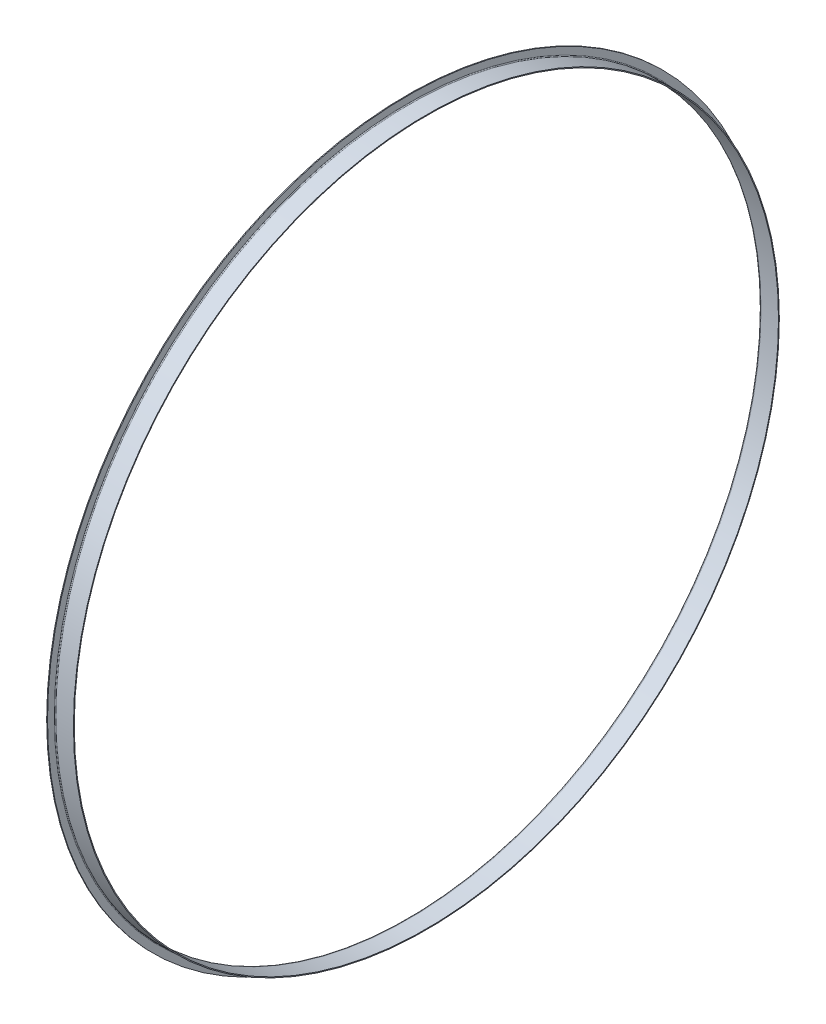
ISO-10303-21;
HEADER;
FILE_DESCRIPTION(('STEP AP214'),'2;1');
FILE_NAME('part.step','',(''),(''),'','','');
FILE_SCHEMA(('AUTOMOTIVE_DESIGN { 1 0 10303 214 1 1 1 1 }'));
ENDSEC;
DATA;
#1=APPLICATION_CONTEXT('core data for automotive mechanical design processes');
#2=APPLICATION_PROTOCOL_DEFINITION('international standard','automotive_design',2000,#1);
#3=PRODUCT_CONTEXT('',#1,'mechanical');
#4=PRODUCT('Part','Part','',(#3));
#5=PRODUCT_RELATED_PRODUCT_CATEGORY('part','',(#4));
#6=PRODUCT_DEFINITION_FORMATION('','',#4);
#7=PRODUCT_DEFINITION_CONTEXT('part definition',#1,'design');
#8=PRODUCT_DEFINITION('design','',#6,#7);
#9=PRODUCT_DEFINITION_SHAPE('','',#8);
#10=(LENGTH_UNIT() NAMED_UNIT(*) SI_UNIT(.MILLI.,.METRE.));
#11=(NAMED_UNIT(*) PLANE_ANGLE_UNIT() SI_UNIT($,.RADIAN.));
#12=(NAMED_UNIT(*) SI_UNIT($,.STERADIAN.) SOLID_ANGLE_UNIT());
#13=UNCERTAINTY_MEASURE_WITH_UNIT(LENGTH_MEASURE(1.E-05),#10,'distance_accuracy_value','');
#14=(GEOMETRIC_REPRESENTATION_CONTEXT(3) GLOBAL_UNCERTAINTY_ASSIGNED_CONTEXT((#13)) GLOBAL_UNIT_ASSIGNED_CONTEXT((#10,
#11,#12)) REPRESENTATION_CONTEXT('',''));
#15=CARTESIAN_POINT('',(0.,0.,0.));
#16=DIRECTION('',(0.,0.,1.));
#17=DIRECTION('',(1.,0.,0.));
#18=AXIS2_PLACEMENT_3D('',#15,#16,#17);
#19=CARTESIAN_POINT('',(12.439024390244,118.402071405808,0.));
#20=DIRECTION('',(-1.,0.,0.));
#21=DIRECTION('',(0.,0.,1.));
#22=AXIS2_PLACEMENT_3D('',#19,#20,#21);
#23=PLANE('',#22);
#24=CARTESIAN_POINT('',(12.439024390244,-1134.59792859419,0.));
#25=DIRECTION('',(-1.,0.,0.));
#26=DIRECTION('',(0.,0.,1.));
#27=AXIS2_PLACEMENT_3D('',#24,#25,#26);
#28=CIRCLE('',#27,1253.);
#29=CARTESIAN_POINT('',(12.439024390244,-1134.59792859419,1253.));
#30=VERTEX_POINT('',#29);
#31=EDGE_CURVE('E58',#30,#30,#28,.T.);
#32=ORIENTED_EDGE('',*,*,#31,.F.);
#33=EDGE_LOOP('',(#32));
#34=FACE_BOUND('',#33,.T.);
#35=CARTESIAN_POINT('',(12.439024390244,-1134.59792859419,0.));
#36=DIRECTION('',(-1.,0.,0.));
#37=DIRECTION('',(0.,0.,1.));
#38=AXIS2_PLACEMENT_3D('',#35,#36,#37);
#39=CIRCLE('',#38,1250.);
#40=CARTESIAN_POINT('',(12.439024390244,-1134.59792859419,1250.));
#41=VERTEX_POINT('',#40);
#42=EDGE_CURVE('E10',#41,#41,#39,.T.);
#43=ORIENTED_EDGE('',*,*,#42,.T.);
#44=EDGE_LOOP('',(#43));
#45=FACE_BOUND('',#44,.T.);
#46=ADVANCED_FACE('F30',(#34,#45),#23,.F.);
#47=CARTESIAN_POINT('',(-55.5609756097559,-1134.59792859419,0.));
#48=DIRECTION('',(-1.,0.,0.));
#49=DIRECTION('',(0.,0.,1.));
#50=AXIS2_PLACEMENT_3D('',#47,#48,#49);
#51=CYLINDRICAL_SURFACE('',#50,1250.);
#52=ORIENTED_EDGE('',*,*,#42,.F.);
#53=EDGE_LOOP('',(#52));
#54=FACE_BOUND('',#53,.T.);
#55=CARTESIAN_POINT('',(-49.560975609756,-1134.59792859419,0.));
#56=DIRECTION('',(-1.,0.,0.));
#57=DIRECTION('',(0.,0.,1.));
#58=AXIS2_PLACEMENT_3D('',#55,#56,#57);
#59=CIRCLE('',#58,1250.);
#60=CARTESIAN_POINT('',(-49.560975609756,-1134.59792859419,1250.));
#61=VERTEX_POINT('',#60);
#62=EDGE_CURVE('E36',#61,#61,#59,.T.);
#63=ORIENTED_EDGE('',*,*,#62,.T.);
#64=EDGE_LOOP('',(#63));
#65=FACE_BOUND('',#64,.T.);
#66=ADVANCED_FACE('F65',(#54,#65),#51,.F.);
#67=CARTESIAN_POINT('',(-49.560975609756,-1134.59792859419,0.));
#68=DIRECTION('',(-1.,0.,0.));
#69=DIRECTION('',(0.,0.,1.));
#70=AXIS2_PLACEMENT_3D('',#67,#68,#69);
#71=TOROIDAL_SURFACE('',#70,1256.,6.);
#72=ORIENTED_EDGE('',*,*,#62,.F.);
#73=EDGE_LOOP('',(#72));
#74=FACE_BOUND('',#73,.T.);
#75=CARTESIAN_POINT('',(-55.560975609756,-1134.59792859419,0.));
#76=DIRECTION('',(-1.,0.,0.));
#77=DIRECTION('',(0.,0.,1.));
#78=AXIS2_PLACEMENT_3D('',#75,#76,#77);
#79=CIRCLE('',#78,1256.);
#80=CARTESIAN_POINT('',(-55.560975609756,-1134.59792859419,1256.));
#81=VERTEX_POINT('',#80);
#82=EDGE_CURVE('E40',#81,#81,#79,.T.);
#83=ORIENTED_EDGE('',*,*,#82,.T.);
#84=EDGE_LOOP('',(#83));
#85=FACE_BOUND('',#84,.T.);
#86=ADVANCED_FACE('F69',(#74,#85),#71,.T.);
#87=CARTESIAN_POINT('',(-55.560975609756,121.402071405808,0.));
#88=DIRECTION('',(1.,0.,0.));
#89=DIRECTION('',(0.,0.,-1.));
#90=AXIS2_PLACEMENT_3D('',#87,#88,#89);
#91=PLANE('',#90);
#92=ORIENTED_EDGE('',*,*,#82,.F.);
#93=EDGE_LOOP('',(#92));
#94=FACE_BOUND('',#93,.T.);
#95=CARTESIAN_POINT('',(-55.560975609756,-1134.59792859419,0.));
#96=DIRECTION('',(-1.,0.,0.));
#97=DIRECTION('',(0.,0.,1.));
#98=AXIS2_PLACEMENT_3D('',#95,#96,#97);
#99=CIRCLE('',#98,1280.);
#100=CARTESIAN_POINT('',(-55.560975609756,-1134.59792859419,1280.));
#101=VERTEX_POINT('',#100);
#102=EDGE_CURVE('E44',#101,#101,#99,.T.);
#103=ORIENTED_EDGE('',*,*,#102,.T.);
#104=EDGE_LOOP('',(#103));
#105=FACE_BOUND('',#104,.T.);
#106=ADVANCED_FACE('F74',(#94,#105),#91,.F.);
#107=CARTESIAN_POINT('',(-55.5609756097559,-1134.59792859419,0.));
#108=DIRECTION('',(-1.,0.,0.));
#109=DIRECTION('',(0.,0.,1.));
#110=AXIS2_PLACEMENT_3D('',#107,#108,#109);
#111=CYLINDRICAL_SURFACE('',#110,1280.);
#112=ORIENTED_EDGE('',*,*,#102,.F.);
#113=EDGE_LOOP('',(#112));
#114=FACE_BOUND('',#113,.T.);
#115=CARTESIAN_POINT('',(-52.560975609756,-1134.59792859419,0.));
#116=DIRECTION('',(-1.,0.,0.));
#117=DIRECTION('',(0.,0.,1.));
#118=AXIS2_PLACEMENT_3D('',#115,#116,#117);
#119=CIRCLE('',#118,1280.);
#120=CARTESIAN_POINT('',(-52.560975609756,-1134.59792859419,1280.));
#121=VERTEX_POINT('',#120);
#122=EDGE_CURVE('E49',#121,#121,#119,.T.);
#123=ORIENTED_EDGE('',*,*,#122,.T.);
#124=EDGE_LOOP('',(#123));
#125=FACE_BOUND('',#124,.T.);
#126=ADVANCED_FACE('F80',(#114,#125),#111,.T.);
#127=CARTESIAN_POINT('',(-52.560975609756,145.402071405808,0.));
#128=DIRECTION('',(-1.,0.,0.));
#129=DIRECTION('',(0.,0.,1.));
#130=AXIS2_PLACEMENT_3D('',#127,#128,#129);
#131=PLANE('',#130);
#132=ORIENTED_EDGE('',*,*,#122,.F.);
#133=EDGE_LOOP('',(#132));
#134=FACE_BOUND('',#133,.T.);
#135=CARTESIAN_POINT('',(-52.560975609756,-1134.59792859419,0.));
#136=DIRECTION('',(-1.,0.,0.));
#137=DIRECTION('',(0.,0.,1.));
#138=AXIS2_PLACEMENT_3D('',#135,#136,#137);
#139=CIRCLE('',#138,1256.);
#140=CARTESIAN_POINT('',(-52.560975609756,-1134.59792859419,1256.));
#141=VERTEX_POINT('',#140);
#142=EDGE_CURVE('E52',#141,#141,#139,.T.);
#143=ORIENTED_EDGE('',*,*,#142,.T.);
#144=EDGE_LOOP('',(#143));
#145=FACE_BOUND('',#144,.T.);
#146=ADVANCED_FACE('F84',(#134,#145),#131,.F.);
#147=CARTESIAN_POINT('',(-49.560975609756,-1134.59792859419,0.));
#148=DIRECTION('',(-1.,0.,0.));
#149=DIRECTION('',(0.,0.,1.));
#150=AXIS2_PLACEMENT_3D('',#147,#148,#149);
#151=TOROIDAL_SURFACE('',#150,1256.,3.);
#152=ORIENTED_EDGE('',*,*,#142,.F.);
#153=EDGE_LOOP('',(#152));
#154=FACE_BOUND('',#153,.T.);
#155=CARTESIAN_POINT('',(-49.560975609756,-1134.59792859419,0.));
#156=DIRECTION('',(-1.,0.,0.));
#157=DIRECTION('',(0.,0.,1.));
#158=AXIS2_PLACEMENT_3D('',#155,#156,#157);
#159=CIRCLE('',#158,1253.);
#160=CARTESIAN_POINT('',(-49.560975609756,-1134.59792859419,1253.));
#161=VERTEX_POINT('',#160);
#162=EDGE_CURVE('E55',#161,#161,#159,.T.);
#163=ORIENTED_EDGE('',*,*,#162,.T.);
#164=EDGE_LOOP('',(#163));
#165=FACE_BOUND('',#164,.T.);
#166=ADVANCED_FACE('F88',(#154,#165),#151,.F.);
#167=CARTESIAN_POINT('',(-55.5609756097559,-1134.59792859419,0.));
#168=DIRECTION('',(-1.,0.,0.));
#169=DIRECTION('',(0.,0.,1.));
#170=AXIS2_PLACEMENT_3D('',#167,#168,#169);
#171=CYLINDRICAL_SURFACE('',#170,1253.);
#172=ORIENTED_EDGE('',*,*,#162,.F.);
#173=EDGE_LOOP('',(#172));
#174=FACE_BOUND('',#173,.T.);
#175=ORIENTED_EDGE('',*,*,#31,.T.);
#176=EDGE_LOOP('',(#175));
#177=FACE_BOUND('',#176,.T.);
#178=ADVANCED_FACE('F62',(#174,#177),#171,.T.);
#179=CLOSED_SHELL('',(#46,#66,#86,#106,#126,#146,#166,#178));
#180=MANIFOLD_SOLID_BREP('B2',#179);
#181=ADVANCED_BREP_SHAPE_REPRESENTATION('',(#18,#180),#14);
#182=SHAPE_DEFINITION_REPRESENTATION(#9,#181);
ENDSEC;
END-ISO-10303-21;
